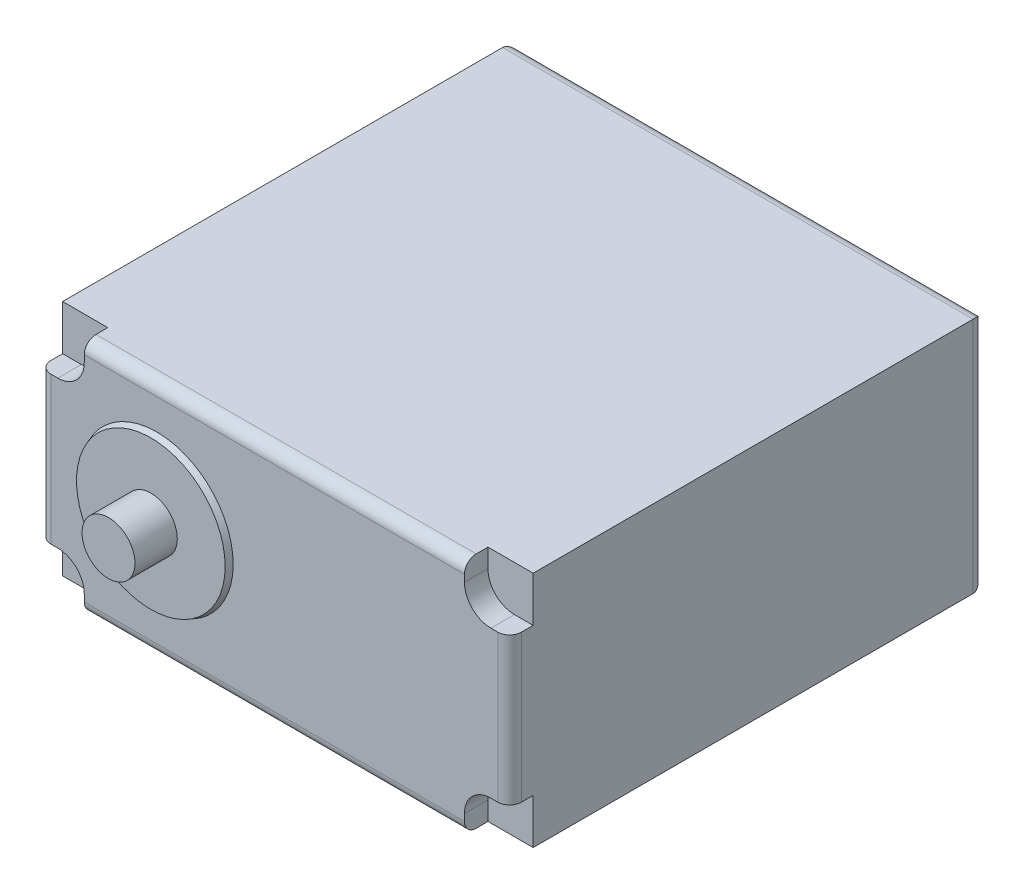
ISO-10303-21;
HEADER;
FILE_DESCRIPTION(('STEP AP214'),'2;1');
FILE_NAME('part.step','',(''),(''),'','','');
FILE_SCHEMA(('AUTOMOTIVE_DESIGN { 1 0 10303 214 1 1 1 1 }'));
ENDSEC;
DATA;
#1=APPLICATION_CONTEXT('core data for automotive mechanical design processes');
#2=APPLICATION_PROTOCOL_DEFINITION('international standard','automotive_design',2000,#1);
#3=PRODUCT_CONTEXT('',#1,'mechanical');
#4=PRODUCT('Part','Part','',(#3));
#5=PRODUCT_RELATED_PRODUCT_CATEGORY('part','',(#4));
#6=PRODUCT_DEFINITION_FORMATION('','',#4);
#7=PRODUCT_DEFINITION_CONTEXT('part definition',#1,'design');
#8=PRODUCT_DEFINITION('design','',#6,#7);
#9=PRODUCT_DEFINITION_SHAPE('','',#8);
#10=(LENGTH_UNIT() NAMED_UNIT(*) SI_UNIT(.MILLI.,.METRE.));
#11=(NAMED_UNIT(*) PLANE_ANGLE_UNIT() SI_UNIT($,.RADIAN.));
#12=(NAMED_UNIT(*) SI_UNIT($,.STERADIAN.) SOLID_ANGLE_UNIT());
#13=UNCERTAINTY_MEASURE_WITH_UNIT(LENGTH_MEASURE(1.E-05),#10,'distance_accuracy_value','');
#14=(GEOMETRIC_REPRESENTATION_CONTEXT(3) GLOBAL_UNCERTAINTY_ASSIGNED_CONTEXT((#13)) GLOBAL_UNIT_ASSIGNED_CONTEXT((#10,
#11,#12)) REPRESENTATION_CONTEXT('',''));
#15=CARTESIAN_POINT('',(0.,0.,0.));
#16=DIRECTION('',(0.,0.,1.));
#17=DIRECTION('',(1.,0.,0.));
#18=AXIS2_PLACEMENT_3D('',#15,#16,#17);
#19=CARTESIAN_POINT('',(0.,20.2,-40.4));
#20=DIRECTION('',(1.,0.,0.));
#21=DIRECTION('',(0.,0.,-1.));
#22=AXIS2_PLACEMENT_3D('',#19,#20,#21);
#23=PLANE('',#22);
#24=DIRECTION('',(0.,-1.,0.));
#25=VECTOR('',#24,1.);
#26=CARTESIAN_POINT('',(0.,20.2,-1.));
#27=LINE('',#26,#25);
#28=CARTESIAN_POINT('',(0.,3.84099025766973,-1.));
#29=VERTEX_POINT('',#28);
#30=CARTESIAN_POINT('',(0.,16.3590097423303,-1.));
#31=VERTEX_POINT('',#30);
#32=EDGE_CURVE('E426',#29,#31,#27,.F.);
#33=ORIENTED_EDGE('',*,*,#32,.T.);
#34=DIRECTION('',(0.,0.,-1.));
#35=VECTOR('',#34,1.);
#36=CARTESIAN_POINT('',(0.,16.3590097423303,-40.4));
#37=LINE('',#36,#35);
#38=CARTESIAN_POINT('',(0.,16.3590097423303,-2.));
#39=VERTEX_POINT('',#38);
#40=EDGE_CURVE('E374',#31,#39,#37,.T.);
#41=ORIENTED_EDGE('',*,*,#40,.T.);
#42=DIRECTION('',(0.,-1.,0.));
#43=VECTOR('',#42,1.);
#44=CARTESIAN_POINT('',(0.,20.2,-2.));
#45=LINE('',#44,#43);
#46=CARTESIAN_POINT('',(0.,20.2,-2.));
#47=VERTEX_POINT('',#46);
#48=EDGE_CURVE('E385',#47,#39,#45,.T.);
#49=ORIENTED_EDGE('',*,*,#48,.F.);
#50=DIRECTION('',(0.,0.,1.));
#51=VECTOR('',#50,1.);
#52=CARTESIAN_POINT('',(0.,20.2,-40.4));
#53=LINE('',#52,#51);
#54=CARTESIAN_POINT('',(0.,20.2,-39.4));
#55=VERTEX_POINT('',#54);
#56=EDGE_CURVE('E393',#55,#47,#53,.T.);
#57=ORIENTED_EDGE('',*,*,#56,.F.);
#58=DIRECTION('',(0.,-1.,0.));
#59=VECTOR('',#58,1.);
#60=CARTESIAN_POINT('',(0.,20.2,-39.4));
#61=LINE('',#60,#59);
#62=CARTESIAN_POINT('',(0.,0.,-39.4));
#63=VERTEX_POINT('',#62);
#64=EDGE_CURVE('E438',#55,#63,#61,.T.);
#65=ORIENTED_EDGE('',*,*,#64,.T.);
#66=DIRECTION('',(0.,0.,1.));
#67=VECTOR('',#66,1.);
#68=CARTESIAN_POINT('',(0.,0.,-40.4));
#69=LINE('',#68,#67);
#70=CARTESIAN_POINT('',(0.,0.,-2.));
#71=VERTEX_POINT('',#70);
#72=EDGE_CURVE('E402',#63,#71,#69,.T.);
#73=ORIENTED_EDGE('',*,*,#72,.T.);
#74=DIRECTION('',(0.,1.,0.));
#75=VECTOR('',#74,1.);
#76=CARTESIAN_POINT('',(0.,20.2,-2.));
#77=LINE('',#76,#75);
#78=CARTESIAN_POINT('',(0.,3.84099025766973,-2.));
#79=VERTEX_POINT('',#78);
#80=EDGE_CURVE('E381',#71,#79,#77,.T.);
#81=ORIENTED_EDGE('',*,*,#80,.T.);
#82=DIRECTION('',(0.,0.,1.));
#83=VECTOR('',#82,1.);
#84=CARTESIAN_POINT('',(0.,3.84099025766973,-40.4));
#85=LINE('',#84,#83);
#86=EDGE_CURVE('E370',#79,#29,#85,.T.);
#87=ORIENTED_EDGE('',*,*,#86,.T.);
#88=EDGE_LOOP('',(#33,#41,#49,#57,#65,#73,#81,#87));
#89=FACE_BOUND('',#88,.T.);
#90=ADVANCED_FACE('F51',(#89),#23,.F.);
#91=CARTESIAN_POINT('',(0.,20.2,0.));
#92=DIRECTION('',(0.,0.,-1.));
#93=DIRECTION('',(-1.,0.,0.));
#94=AXIS2_PLACEMENT_3D('',#91,#92,#93);
#95=PLANE('',#94);
#96=CARTESIAN_POINT('',(10.,10.1,0.));
#97=DIRECTION('',(0.,0.,-1.));
#98=DIRECTION('',(-1.,0.,0.));
#99=AXIS2_PLACEMENT_3D('',#96,#97,#98);
#100=CIRCLE('',#99,6.5);
#101=CARTESIAN_POINT('',(3.5,10.1,0.));
#102=VERTEX_POINT('',#101);
#103=EDGE_CURVE('E55',#102,#102,#100,.F.);
#104=ORIENTED_EDGE('',*,*,#103,.F.);
#105=EDGE_LOOP('',(#104));
#106=FACE_BOUND('',#105,.T.);
#107=CARTESIAN_POINT('',(38.4090097423303,18.6090097423303,0.));
#108=DIRECTION('',(0.,0.,1.));
#109=DIRECTION('',(-1.,0.,0.));
#110=AXIS2_PLACEMENT_3D('',#107,#108,#109);
#111=CIRCLE('',#110,2.25);
#112=CARTESIAN_POINT('',(36.1590097423303,18.6090097423303,0.));
#113=VERTEX_POINT('',#112);
#114=CARTESIAN_POINT('',(38.4090097423303,16.3590097423303,0.));
#115=VERTEX_POINT('',#114);
#116=EDGE_CURVE('E279',#113,#115,#111,.T.);
#117=ORIENTED_EDGE('',*,*,#116,.F.);
#118=DIRECTION('',(0.,-1.,0.));
#119=VECTOR('',#118,1.);
#120=CARTESIAN_POINT('',(36.1590097423303,18.6090097423303,0.));
#121=LINE('',#120,#119);
#122=CARTESIAN_POINT('',(36.1590097423303,19.2,0.));
#123=VERTEX_POINT('',#122);
#124=EDGE_CURVE('E307',#123,#113,#121,.T.);
#125=ORIENTED_EDGE('',*,*,#124,.F.);
#126=DIRECTION('',(1.,0.,0.));
#127=VECTOR('',#126,1.);
#128=CARTESIAN_POINT('',(0.,19.2,0.));
#129=LINE('',#128,#127);
#130=CARTESIAN_POINT('',(3.84099025766973,19.2,0.));
#131=VERTEX_POINT('',#130);
#132=EDGE_CURVE('E412',#123,#131,#129,.F.);
#133=ORIENTED_EDGE('',*,*,#132,.T.);
#134=DIRECTION('',(0.,1.,0.));
#135=VECTOR('',#134,1.);
#136=CARTESIAN_POINT('',(3.84099025766973,18.6090097423303,0.));
#137=LINE('',#136,#135);
#138=CARTESIAN_POINT('',(3.84099025766973,18.6090097423303,0.));
#139=VERTEX_POINT('',#138);
#140=EDGE_CURVE('E68',#139,#131,#137,.T.);
#141=ORIENTED_EDGE('',*,*,#140,.F.);
#142=CARTESIAN_POINT('',(1.59099025766973,18.6090097423303,0.));
#143=DIRECTION('',(0.,0.,1.));
#144=DIRECTION('',(1.,0.,0.));
#145=AXIS2_PLACEMENT_3D('',#142,#143,#144);
#146=CIRCLE('',#145,2.25);
#147=CARTESIAN_POINT('',(1.59099025766973,16.3590097423303,0.));
#148=VERTEX_POINT('',#147);
#149=EDGE_CURVE('E248',#148,#139,#146,.T.);
#150=ORIENTED_EDGE('',*,*,#149,.F.);
#151=DIRECTION('',(1.,0.,0.));
#152=VECTOR('',#151,1.);
#153=CARTESIAN_POINT('',(1.59099025766973,16.3590097423303,0.));
#154=LINE('',#153,#152);
#155=CARTESIAN_POINT('',(1.,16.3590097423303,0.));
#156=VERTEX_POINT('',#155);
#157=EDGE_CURVE('E280',#156,#148,#154,.T.);
#158=ORIENTED_EDGE('',*,*,#157,.F.);
#159=DIRECTION('',(0.,-1.,0.));
#160=VECTOR('',#159,1.);
#161=CARTESIAN_POINT('',(1.,20.2,0.));
#162=LINE('',#161,#160);
#163=CARTESIAN_POINT('',(1.,3.84099025766973,0.));
#164=VERTEX_POINT('',#163);
#165=EDGE_CURVE('E416',#156,#164,#162,.T.);
#166=ORIENTED_EDGE('',*,*,#165,.T.);
#167=DIRECTION('',(-1.,0.,0.));
#168=VECTOR('',#167,1.);
#169=CARTESIAN_POINT('',(1.59099025766973,3.84099025766973,0.));
#170=LINE('',#169,#168);
#171=CARTESIAN_POINT('',(1.59099025766973,3.84099025766973,0.));
#172=VERTEX_POINT('',#171);
#173=EDGE_CURVE('E237',#172,#164,#170,.T.);
#174=ORIENTED_EDGE('',*,*,#173,.F.);
#175=CARTESIAN_POINT('',(1.59099025766973,1.59099025766973,0.));
#176=DIRECTION('',(0.,0.,1.));
#177=DIRECTION('',(-1.,0.,0.));
#178=AXIS2_PLACEMENT_3D('',#175,#176,#177);
#179=CIRCLE('',#178,2.25);
#180=CARTESIAN_POINT('',(3.84099025766973,1.59099025766973,0.));
#181=VERTEX_POINT('',#180);
#182=EDGE_CURVE('E243',#181,#172,#179,.T.);
#183=ORIENTED_EDGE('',*,*,#182,.F.);
#184=DIRECTION('',(0.,1.,0.));
#185=VECTOR('',#184,1.);
#186=CARTESIAN_POINT('',(3.84099025766973,1.59099025766973,0.));
#187=LINE('',#186,#185);
#188=CARTESIAN_POINT('',(3.84099025766973,1.,0.));
#189=VERTEX_POINT('',#188);
#190=EDGE_CURVE('E226',#189,#181,#187,.T.);
#191=ORIENTED_EDGE('',*,*,#190,.F.);
#192=DIRECTION('',(1.,0.,0.));
#193=VECTOR('',#192,1.);
#194=CARTESIAN_POINT('',(0.,1.,0.));
#195=LINE('',#194,#193);
#196=CARTESIAN_POINT('',(36.1590097423303,1.,0.));
#197=VERTEX_POINT('',#196);
#198=EDGE_CURVE('E423',#189,#197,#195,.T.);
#199=ORIENTED_EDGE('',*,*,#198,.T.);
#200=DIRECTION('',(0.,-1.,0.));
#201=VECTOR('',#200,1.);
#202=CARTESIAN_POINT('',(36.1590097423303,1.59099025766973,0.));
#203=LINE('',#202,#201);
#204=CARTESIAN_POINT('',(36.1590097423303,1.59099025766973,0.));
#205=VERTEX_POINT('',#204);
#206=EDGE_CURVE('E254',#205,#197,#203,.T.);
#207=ORIENTED_EDGE('',*,*,#206,.F.);
#208=CARTESIAN_POINT('',(38.4090097423303,1.59099025766973,0.));
#209=DIRECTION('',(0.,0.,1.));
#210=DIRECTION('',(1.,0.,0.));
#211=AXIS2_PLACEMENT_3D('',#208,#209,#210);
#212=CIRCLE('',#211,2.25);
#213=CARTESIAN_POINT('',(38.4090097423303,3.84099025766973,0.));
#214=VERTEX_POINT('',#213);
#215=EDGE_CURVE('E331',#214,#205,#212,.T.);
#216=ORIENTED_EDGE('',*,*,#215,.F.);
#217=DIRECTION('',(-1.,0.,0.));
#218=VECTOR('',#217,1.);
#219=CARTESIAN_POINT('',(38.4090097423303,3.84099025766973,0.));
#220=LINE('',#219,#218);
#221=CARTESIAN_POINT('',(39.,3.84099025766973,0.));
#222=VERTEX_POINT('',#221);
#223=EDGE_CURVE('E258',#222,#214,#220,.T.);
#224=ORIENTED_EDGE('',*,*,#223,.F.);
#225=DIRECTION('',(0.,-1.,0.));
#226=VECTOR('',#225,1.);
#227=CARTESIAN_POINT('',(39.,20.2,0.));
#228=LINE('',#227,#226);
#229=CARTESIAN_POINT('',(39.,16.3590097423303,0.));
#230=VERTEX_POINT('',#229);
#231=EDGE_CURVE('E419',#222,#230,#228,.F.);
#232=ORIENTED_EDGE('',*,*,#231,.T.);
#233=DIRECTION('',(1.,0.,0.));
#234=VECTOR('',#233,1.);
#235=CARTESIAN_POINT('',(38.4090097423303,16.3590097423303,0.));
#236=LINE('',#235,#234);
#237=EDGE_CURVE('E310',#115,#230,#236,.T.);
#238=ORIENTED_EDGE('',*,*,#237,.F.);
#239=EDGE_LOOP('',(#117,#125,#133,#141,#150,#158,#166,#174,#183,#191,#199,#207,#216,#224,#232,#238));
#240=FACE_BOUND('',#239,.T.);
#241=ADVANCED_FACE('F251',(#106,#240),#95,.F.);
#242=CARTESIAN_POINT('',(40.,20.2,0.));
#243=DIRECTION('',(-1.,0.,0.));
#244=DIRECTION('',(0.,0.,1.));
#245=AXIS2_PLACEMENT_3D('',#242,#243,#244);
#246=PLANE('',#245);
#247=DIRECTION('',(0.,-1.,0.));
#248=VECTOR('',#247,1.);
#249=CARTESIAN_POINT('',(40.,20.2,-2.));
#250=LINE('',#249,#248);
#251=CARTESIAN_POINT('',(40.,20.2,-2.));
#252=VERTEX_POINT('',#251);
#253=CARTESIAN_POINT('',(40.,16.3590097423303,-2.));
#254=VERTEX_POINT('',#253);
#255=EDGE_CURVE('E388',#252,#254,#250,.T.);
#256=ORIENTED_EDGE('',*,*,#255,.T.);
#257=DIRECTION('',(0.,0.,1.));
#258=VECTOR('',#257,1.);
#259=CARTESIAN_POINT('',(40.,16.3590097423303,0.));
#260=LINE('',#259,#258);
#261=CARTESIAN_POINT('',(40.,16.3590097423303,-1.));
#262=VERTEX_POINT('',#261);
#263=EDGE_CURVE('E354',#254,#262,#260,.T.);
#264=ORIENTED_EDGE('',*,*,#263,.T.);
#265=DIRECTION('',(0.,-1.,0.));
#266=VECTOR('',#265,1.);
#267=CARTESIAN_POINT('',(40.,20.2,-1.));
#268=LINE('',#267,#266);
#269=CARTESIAN_POINT('',(40.,3.84099025766973,-1.));
#270=VERTEX_POINT('',#269);
#271=EDGE_CURVE('E401',#262,#270,#268,.T.);
#272=ORIENTED_EDGE('',*,*,#271,.T.);
#273=DIRECTION('',(0.,0.,-1.));
#274=VECTOR('',#273,1.);
#275=CARTESIAN_POINT('',(40.,3.84099025766973,0.));
#276=LINE('',#275,#274);
#277=CARTESIAN_POINT('',(40.,3.84099025766973,-2.));
#278=VERTEX_POINT('',#277);
#279=EDGE_CURVE('E347',#270,#278,#276,.T.);
#280=ORIENTED_EDGE('',*,*,#279,.T.);
#281=DIRECTION('',(0.,1.,0.));
#282=VECTOR('',#281,1.);
#283=CARTESIAN_POINT('',(40.,20.2,-2.));
#284=LINE('',#283,#282);
#285=CARTESIAN_POINT('',(40.,0.,-2.));
#286=VERTEX_POINT('',#285);
#287=EDGE_CURVE('E378',#286,#278,#284,.T.);
#288=ORIENTED_EDGE('',*,*,#287,.F.);
#289=DIRECTION('',(0.,0.,-1.));
#290=VECTOR('',#289,1.);
#291=CARTESIAN_POINT('',(40.,0.,0.));
#292=LINE('',#291,#290);
#293=CARTESIAN_POINT('',(40.,0.,-39.4));
#294=VERTEX_POINT('',#293);
#295=EDGE_CURVE('E398',#286,#294,#292,.T.);
#296=ORIENTED_EDGE('',*,*,#295,.T.);
#297=DIRECTION('',(0.,-1.,0.));
#298=VECTOR('',#297,1.);
#299=CARTESIAN_POINT('',(40.,20.2,-39.4));
#300=LINE('',#299,#298);
#301=CARTESIAN_POINT('',(40.,20.2,-39.4));
#302=VERTEX_POINT('',#301);
#303=EDGE_CURVE('E455',#294,#302,#300,.F.);
#304=ORIENTED_EDGE('',*,*,#303,.T.);
#305=DIRECTION('',(0.,0.,-1.));
#306=VECTOR('',#305,1.);
#307=CARTESIAN_POINT('',(40.,20.2,0.));
#308=LINE('',#307,#306);
#309=EDGE_CURVE('E397',#252,#302,#308,.T.);
#310=ORIENTED_EDGE('',*,*,#309,.F.);
#311=EDGE_LOOP('',(#256,#264,#272,#280,#288,#296,#304,#310));
#312=FACE_BOUND('',#311,.T.);
#313=ADVANCED_FACE('F523',(#312),#246,.F.);
#314=CARTESIAN_POINT('',(40.,20.2,-40.4));
#315=DIRECTION('',(0.,0.,1.));
#316=DIRECTION('',(1.,0.,0.));
#317=AXIS2_PLACEMENT_3D('',#314,#315,#316);
#318=PLANE('',#317);
#319=CARTESIAN_POINT('',(10.,10.1,-40.4));
#320=DIRECTION('',(0.,0.,1.));
#321=DIRECTION('',(1.,0.,0.));
#322=AXIS2_PLACEMENT_3D('',#319,#320,#321);
#323=CIRCLE('',#322,6.5);
#324=CARTESIAN_POINT('',(16.5,10.1,-40.4));
#325=VERTEX_POINT('',#324);
#326=EDGE_CURVE('E682',#325,#325,#323,.T.);
#327=ORIENTED_EDGE('',*,*,#326,.T.);
#328=EDGE_LOOP('',(#327));
#329=FACE_BOUND('',#328,.T.);
#330=DIRECTION('',(0.,-1.,0.));
#331=VECTOR('',#330,1.);
#332=CARTESIAN_POINT('',(39.,20.2,-40.4));
#333=LINE('',#332,#331);
#334=CARTESIAN_POINT('',(39.,19.2,-40.4));
#335=VERTEX_POINT('',#334);
#336=CARTESIAN_POINT('',(39.,1.,-40.4));
#337=VERTEX_POINT('',#336);
#338=EDGE_CURVE('E445',#335,#337,#333,.T.);
#339=ORIENTED_EDGE('',*,*,#338,.T.);
#340=DIRECTION('',(-1.,0.,0.));
#341=VECTOR('',#340,1.);
#342=CARTESIAN_POINT('',(40.,1.,-40.4));
#343=LINE('',#342,#341);
#344=CARTESIAN_POINT('',(1.,1.,-40.4));
#345=VERTEX_POINT('',#344);
#346=EDGE_CURVE('E452',#337,#345,#343,.T.);
#347=ORIENTED_EDGE('',*,*,#346,.T.);
#348=DIRECTION('',(0.,-1.,0.));
#349=VECTOR('',#348,1.);
#350=CARTESIAN_POINT('',(1.,20.2,-40.4));
#351=LINE('',#350,#349);
#352=CARTESIAN_POINT('',(1.,19.2,-40.4));
#353=VERTEX_POINT('',#352);
#354=EDGE_CURVE('E448',#345,#353,#351,.F.);
#355=ORIENTED_EDGE('',*,*,#354,.T.);
#356=DIRECTION('',(-1.,0.,0.));
#357=VECTOR('',#356,1.);
#358=CARTESIAN_POINT('',(40.,19.2,-40.4));
#359=LINE('',#358,#357);
#360=EDGE_CURVE('E442',#353,#335,#359,.F.);
#361=ORIENTED_EDGE('',*,*,#360,.T.);
#362=EDGE_LOOP('',(#339,#347,#355,#361));
#363=FACE_BOUND('',#362,.T.);
#364=ADVANCED_FACE('F530',(#329,#363),#318,.F.);
#365=CARTESIAN_POINT('',(0.,20.2,0.));
#366=DIRECTION('',(0.,1.,0.));
#367=DIRECTION('',(0.,0.,1.));
#368=AXIS2_PLACEMENT_3D('',#365,#366,#367);
#369=PLANE('',#368);
#370=DIRECTION('',(0.,0.,1.));
#371=VECTOR('',#370,1.);
#372=CARTESIAN_POINT('',(36.1590097423303,20.2,0.));
#373=LINE('',#372,#371);
#374=CARTESIAN_POINT('',(36.1590097423303,20.2,-2.));
#375=VERTEX_POINT('',#374);
#376=CARTESIAN_POINT('',(36.1590097423303,20.2,-1.));
#377=VERTEX_POINT('',#376);
#378=EDGE_CURVE('E367',#375,#377,#373,.T.);
#379=ORIENTED_EDGE('',*,*,#378,.F.);
#380=DIRECTION('',(-1.,0.,0.));
#381=VECTOR('',#380,1.);
#382=CARTESIAN_POINT('',(0.,20.2,-2.));
#383=LINE('',#382,#381);
#384=EDGE_CURVE('E511',#252,#375,#383,.T.);
#385=ORIENTED_EDGE('',*,*,#384,.F.);
#386=ORIENTED_EDGE('',*,*,#309,.T.);
#387=DIRECTION('',(-1.,0.,0.));
#388=VECTOR('',#387,1.);
#389=CARTESIAN_POINT('',(0.,20.2,-39.4));
#390=LINE('',#389,#388);
#391=EDGE_CURVE('E463',#302,#55,#390,.T.);
#392=ORIENTED_EDGE('',*,*,#391,.T.);
#393=ORIENTED_EDGE('',*,*,#56,.T.);
#394=DIRECTION('',(1.,0.,0.));
#395=VECTOR('',#394,1.);
#396=CARTESIAN_POINT('',(0.,20.2,-2.));
#397=LINE('',#396,#395);
#398=CARTESIAN_POINT('',(3.84099025766973,20.2,-2.));
#399=VERTEX_POINT('',#398);
#400=EDGE_CURVE('E508',#47,#399,#397,.T.);
#401=ORIENTED_EDGE('',*,*,#400,.T.);
#402=DIRECTION('',(0.,0.,-1.));
#403=VECTOR('',#402,1.);
#404=CARTESIAN_POINT('',(3.84099025766973,20.2,0.));
#405=LINE('',#404,#403);
#406=CARTESIAN_POINT('',(3.84099025766973,20.2,-1.));
#407=VERTEX_POINT('',#406);
#408=EDGE_CURVE('E364',#407,#399,#405,.T.);
#409=ORIENTED_EDGE('',*,*,#408,.F.);
#410=DIRECTION('',(1.,0.,0.));
#411=VECTOR('',#410,1.);
#412=CARTESIAN_POINT('',(40.,20.2,-1.));
#413=LINE('',#412,#411);
#414=EDGE_CURVE('E434',#407,#377,#413,.T.);
#415=ORIENTED_EDGE('',*,*,#414,.T.);
#416=EDGE_LOOP('',(#379,#385,#386,#392,#393,#401,#409,#415));
#417=FACE_BOUND('',#416,.T.);
#418=ADVANCED_FACE('F609',(#417),#369,.T.);
#419=CARTESIAN_POINT('',(0.,0.,0.));
#420=DIRECTION('',(0.,1.,0.));
#421=DIRECTION('',(0.,0.,1.));
#422=AXIS2_PLACEMENT_3D('',#419,#420,#421);
#423=PLANE('',#422);
#424=DIRECTION('',(1.,0.,0.));
#425=VECTOR('',#424,1.);
#426=CARTESIAN_POINT('',(0.,0.,-1.));
#427=LINE('',#426,#425);
#428=CARTESIAN_POINT('',(36.1590097423303,0.,-1.));
#429=VERTEX_POINT('',#428);
#430=CARTESIAN_POINT('',(3.84099025766973,0.,-1.));
#431=VERTEX_POINT('',#430);
#432=EDGE_CURVE('E430',#429,#431,#427,.F.);
#433=ORIENTED_EDGE('',*,*,#432,.T.);
#434=DIRECTION('',(0.,0.,-1.));
#435=VECTOR('',#434,1.);
#436=CARTESIAN_POINT('',(3.84099025766973,0.,0.));
#437=LINE('',#436,#435);
#438=CARTESIAN_POINT('',(3.84099025766973,0.,-2.));
#439=VERTEX_POINT('',#438);
#440=EDGE_CURVE('E76',#431,#439,#437,.T.);
#441=ORIENTED_EDGE('',*,*,#440,.T.);
#442=DIRECTION('',(-1.,0.,0.));
#443=VECTOR('',#442,1.);
#444=CARTESIAN_POINT('',(0.,0.,-2.));
#445=LINE('',#444,#443);
#446=EDGE_CURVE('E504',#439,#71,#445,.T.);
#447=ORIENTED_EDGE('',*,*,#446,.T.);
#448=ORIENTED_EDGE('',*,*,#72,.F.);
#449=DIRECTION('',(-1.,0.,0.));
#450=VECTOR('',#449,1.);
#451=CARTESIAN_POINT('',(0.,0.,-39.4));
#452=LINE('',#451,#450);
#453=EDGE_CURVE('E459',#63,#294,#452,.F.);
#454=ORIENTED_EDGE('',*,*,#453,.T.);
#455=ORIENTED_EDGE('',*,*,#295,.F.);
#456=DIRECTION('',(1.,0.,0.));
#457=VECTOR('',#456,1.);
#458=CARTESIAN_POINT('',(0.,0.,-2.));
#459=LINE('',#458,#457);
#460=CARTESIAN_POINT('',(36.1590097423303,0.,-2.));
#461=VERTEX_POINT('',#460);
#462=EDGE_CURVE('E501',#461,#286,#459,.T.);
#463=ORIENTED_EDGE('',*,*,#462,.F.);
#464=DIRECTION('',(0.,0.,1.));
#465=VECTOR('',#464,1.);
#466=CARTESIAN_POINT('',(36.1590097423303,0.,0.));
#467=LINE('',#466,#465);
#468=EDGE_CURVE('E358',#461,#429,#467,.T.);
#469=ORIENTED_EDGE('',*,*,#468,.T.);
#470=EDGE_LOOP('',(#433,#441,#447,#448,#454,#455,#463,#469));
#471=FACE_BOUND('',#470,.T.);
#472=ADVANCED_FACE('F553',(#471),#423,.F.);
#473=CARTESIAN_POINT('',(1.,20.2,-1.));
#474=DIRECTION('',(0.,-1.,0.));
#475=DIRECTION('',(0.,0.,-1.));
#476=AXIS2_PLACEMENT_3D('',#473,#474,#475);
#477=CYLINDRICAL_SURFACE('',#476,1.);
#478=CARTESIAN_POINT('',(1.,16.3590097423303,-1.));
#479=DIRECTION('',(0.,-1.,0.));
#480=DIRECTION('',(0.,0.,-1.));
#481=AXIS2_PLACEMENT_3D('',#478,#479,#480);
#482=CIRCLE('',#481,1.);
#483=EDGE_CURVE('E498',#31,#156,#482,.F.);
#484=ORIENTED_EDGE('',*,*,#483,.F.);
#485=ORIENTED_EDGE('',*,*,#32,.F.);
#486=CARTESIAN_POINT('',(1.,3.84099025766973,-1.));
#487=DIRECTION('',(0.,1.,0.));
#488=DIRECTION('',(0.,0.,1.));
#489=AXIS2_PLACEMENT_3D('',#486,#487,#488);
#490=CIRCLE('',#489,1.);
#491=EDGE_CURVE('E495',#164,#29,#490,.F.);
#492=ORIENTED_EDGE('',*,*,#491,.F.);
#493=ORIENTED_EDGE('',*,*,#165,.F.);
#494=EDGE_LOOP('',(#484,#485,#492,#493));
#495=FACE_BOUND('',#494,.T.);
#496=ADVANCED_FACE('F549',(#495),#477,.T.);
#497=CARTESIAN_POINT('',(0.,19.2,-1.));
#498=DIRECTION('',(-1.,0.,0.));
#499=DIRECTION('',(0.,0.,1.));
#500=AXIS2_PLACEMENT_3D('',#497,#498,#499);
#501=CYLINDRICAL_SURFACE('',#500,1.);
#502=CARTESIAN_POINT('',(36.1590097423303,19.2,-1.));
#503=DIRECTION('',(-1.,0.,0.));
#504=DIRECTION('',(0.,0.,1.));
#505=AXIS2_PLACEMENT_3D('',#502,#503,#504);
#506=CIRCLE('',#505,1.);
#507=EDGE_CURVE('E492',#377,#123,#506,.F.);
#508=ORIENTED_EDGE('',*,*,#507,.F.);
#509=ORIENTED_EDGE('',*,*,#414,.F.);
#510=CARTESIAN_POINT('',(3.84099025766973,19.2,-1.));
#511=DIRECTION('',(1.,0.,0.));
#512=DIRECTION('',(0.,0.,-1.));
#513=AXIS2_PLACEMENT_3D('',#510,#511,#512);
#514=CIRCLE('',#513,1.);
#515=EDGE_CURVE('E489',#131,#407,#514,.F.);
#516=ORIENTED_EDGE('',*,*,#515,.F.);
#517=ORIENTED_EDGE('',*,*,#132,.F.);
#518=EDGE_LOOP('',(#508,#509,#516,#517));
#519=FACE_BOUND('',#518,.T.);
#520=ADVANCED_FACE('F545',(#519),#501,.T.);
#521=CARTESIAN_POINT('',(0.,1.,-1.));
#522=DIRECTION('',(1.,0.,0.));
#523=DIRECTION('',(0.,0.,-1.));
#524=AXIS2_PLACEMENT_3D('',#521,#522,#523);
#525=CYLINDRICAL_SURFACE('',#524,1.);
#526=CARTESIAN_POINT('',(3.84099025766973,1.,-1.));
#527=DIRECTION('',(1.,0.,0.));
#528=DIRECTION('',(0.,0.,-1.));
#529=AXIS2_PLACEMENT_3D('',#526,#527,#528);
#530=CIRCLE('',#529,1.);
#531=EDGE_CURVE('E231',#431,#189,#530,.F.);
#532=ORIENTED_EDGE('',*,*,#531,.F.);
#533=ORIENTED_EDGE('',*,*,#432,.F.);
#534=CARTESIAN_POINT('',(36.1590097423303,1.,-1.));
#535=DIRECTION('',(-1.,0.,0.));
#536=DIRECTION('',(0.,0.,1.));
#537=AXIS2_PLACEMENT_3D('',#534,#535,#536);
#538=CIRCLE('',#537,1.);
#539=EDGE_CURVE('E484',#197,#429,#538,.F.);
#540=ORIENTED_EDGE('',*,*,#539,.F.);
#541=ORIENTED_EDGE('',*,*,#198,.F.);
#542=EDGE_LOOP('',(#532,#533,#540,#541));
#543=FACE_BOUND('',#542,.T.);
#544=ADVANCED_FACE('F541',(#543),#525,.T.);
#545=CARTESIAN_POINT('',(39.,20.2,-1.));
#546=DIRECTION('',(0.,-1.,0.));
#547=DIRECTION('',(0.,0.,-1.));
#548=AXIS2_PLACEMENT_3D('',#545,#546,#547);
#549=CYLINDRICAL_SURFACE('',#548,1.);
#550=CARTESIAN_POINT('',(39.,16.3590097423303,-1.));
#551=DIRECTION('',(0.,-1.,0.));
#552=DIRECTION('',(0.,0.,-1.));
#553=AXIS2_PLACEMENT_3D('',#550,#551,#552);
#554=CIRCLE('',#553,1.);
#555=EDGE_CURVE('E481',#230,#262,#554,.F.);
#556=ORIENTED_EDGE('',*,*,#555,.F.);
#557=ORIENTED_EDGE('',*,*,#231,.F.);
#558=CARTESIAN_POINT('',(39.,3.84099025766973,-1.));
#559=DIRECTION('',(0.,1.,0.));
#560=DIRECTION('',(0.,0.,1.));
#561=AXIS2_PLACEMENT_3D('',#558,#559,#560);
#562=CIRCLE('',#561,1.);
#563=EDGE_CURVE('E466',#270,#222,#562,.F.);
#564=ORIENTED_EDGE('',*,*,#563,.F.);
#565=ORIENTED_EDGE('',*,*,#271,.F.);
#566=EDGE_LOOP('',(#556,#557,#564,#565));
#567=FACE_BOUND('',#566,.T.);
#568=ADVANCED_FACE('F538',(#567),#549,.T.);
#569=CARTESIAN_POINT('',(39.,20.2,-39.4));
#570=DIRECTION('',(0.,-1.,0.));
#571=DIRECTION('',(0.,0.,-1.));
#572=AXIS2_PLACEMENT_3D('',#569,#570,#571);
#573=CYLINDRICAL_SURFACE('',#572,1.);
#574=CARTESIAN_POINT('',(39.,1.,-39.4));
#575=DIRECTION('',(-0.707106781186547,-0.707106781186547,0.));
#576=DIRECTION('',(-0.707106781186547,0.707106781186547,0.));
#577=AXIS2_PLACEMENT_3D('',#574,#575,#576);
#578=ELLIPSE('',#577,1.41421356237309,1.);
#579=EDGE_CURVE('E472',#337,#294,#578,.T.);
#580=ORIENTED_EDGE('',*,*,#579,.F.);
#581=ORIENTED_EDGE('',*,*,#338,.F.);
#582=CARTESIAN_POINT('',(39.,19.2,-39.4));
#583=DIRECTION('',(0.707106781186547,-0.707106781186547,0.));
#584=DIRECTION('',(0.707106781186547,0.707106781186547,0.));
#585=AXIS2_PLACEMENT_3D('',#582,#583,#584);
#586=ELLIPSE('',#585,1.41421356237309,1.);
#587=EDGE_CURVE('E406',#302,#335,#586,.F.);
#588=ORIENTED_EDGE('',*,*,#587,.F.);
#589=ORIENTED_EDGE('',*,*,#303,.F.);
#590=EDGE_LOOP('',(#580,#581,#588,#589));
#591=FACE_BOUND('',#590,.T.);
#592=ADVANCED_FACE('F53',(#591),#573,.T.);
#593=CARTESIAN_POINT('',(0.,19.2,-39.4));
#594=DIRECTION('',(1.,0.,0.));
#595=DIRECTION('',(0.,0.,-1.));
#596=AXIS2_PLACEMENT_3D('',#593,#594,#595);
#597=CYLINDRICAL_SURFACE('',#596,1.);
#598=ORIENTED_EDGE('',*,*,#587,.T.);
#599=ORIENTED_EDGE('',*,*,#360,.F.);
#600=CARTESIAN_POINT('',(1.,19.2,-39.4));
#601=DIRECTION('',(0.707106781186547,0.707106781186547,0.));
#602=DIRECTION('',(0.707106781186547,-0.707106781186547,0.));
#603=AXIS2_PLACEMENT_3D('',#600,#601,#602);
#604=ELLIPSE('',#603,1.41421356237309,1.);
#605=EDGE_CURVE('E469',#55,#353,#604,.F.);
#606=ORIENTED_EDGE('',*,*,#605,.F.);
#607=ORIENTED_EDGE('',*,*,#391,.F.);
#608=EDGE_LOOP('',(#598,#599,#606,#607));
#609=FACE_BOUND('',#608,.T.);
#610=ADVANCED_FACE('F562',(#609),#597,.T.);
#611=CARTESIAN_POINT('',(40.,1.,-39.4));
#612=DIRECTION('',(-1.,0.,0.));
#613=DIRECTION('',(0.,0.,1.));
#614=AXIS2_PLACEMENT_3D('',#611,#612,#613);
#615=CYLINDRICAL_SURFACE('',#614,1.);
#616=ORIENTED_EDGE('',*,*,#579,.T.);
#617=ORIENTED_EDGE('',*,*,#453,.F.);
#618=CARTESIAN_POINT('',(1.,1.,-39.4));
#619=DIRECTION('',(-0.707106781186547,0.707106781186547,0.));
#620=DIRECTION('',(-0.707106781186547,-0.707106781186547,0.));
#621=AXIS2_PLACEMENT_3D('',#618,#619,#620);
#622=ELLIPSE('',#621,1.41421356237309,1.);
#623=EDGE_CURVE('E392',#345,#63,#622,.T.);
#624=ORIENTED_EDGE('',*,*,#623,.F.);
#625=ORIENTED_EDGE('',*,*,#346,.F.);
#626=EDGE_LOOP('',(#616,#617,#624,#625));
#627=FACE_BOUND('',#626,.T.);
#628=ADVANCED_FACE('F559',(#627),#615,.T.);
#629=CARTESIAN_POINT('',(1.,20.2,-39.4));
#630=DIRECTION('',(0.,-1.,0.));
#631=DIRECTION('',(0.,0.,-1.));
#632=AXIS2_PLACEMENT_3D('',#629,#630,#631);
#633=CYLINDRICAL_SURFACE('',#632,1.);
#634=ORIENTED_EDGE('',*,*,#605,.T.);
#635=ORIENTED_EDGE('',*,*,#354,.F.);
#636=ORIENTED_EDGE('',*,*,#623,.T.);
#637=ORIENTED_EDGE('',*,*,#64,.F.);
#638=EDGE_LOOP('',(#634,#635,#636,#637));
#639=FACE_BOUND('',#638,.T.);
#640=ADVANCED_FACE('F555',(#639),#633,.T.);
#641=CARTESIAN_POINT('',(38.4090097423303,1.59099025766973,-2.));
#642=DIRECTION('',(0.,0.,1.));
#643=DIRECTION('',(1.,0.,0.));
#644=AXIS2_PLACEMENT_3D('',#641,#642,#643);
#645=PLANE('',#644);
#646=ORIENTED_EDGE('',*,*,#287,.T.);
#647=DIRECTION('',(-1.,0.,0.));
#648=VECTOR('',#647,1.);
#649=CARTESIAN_POINT('',(38.4090097423303,3.84099025766973,-2.));
#650=LINE('',#649,#648);
#651=CARTESIAN_POINT('',(38.4090097423303,3.84099025766973,-2.));
#652=VERTEX_POINT('',#651);
#653=EDGE_CURVE('E330',#278,#652,#650,.T.);
#654=ORIENTED_EDGE('',*,*,#653,.T.);
#655=CARTESIAN_POINT('',(38.4090097423303,1.59099025766973,-2.));
#656=DIRECTION('',(0.,0.,1.));
#657=DIRECTION('',(1.,0.,0.));
#658=AXIS2_PLACEMENT_3D('',#655,#656,#657);
#659=CIRCLE('',#658,2.25);
#660=CARTESIAN_POINT('',(36.1590097423303,1.59099025766973,-2.));
#661=VERTEX_POINT('',#660);
#662=EDGE_CURVE('E334',#652,#661,#659,.T.);
#663=ORIENTED_EDGE('',*,*,#662,.T.);
#664=DIRECTION('',(0.,-1.,0.));
#665=VECTOR('',#664,1.);
#666=CARTESIAN_POINT('',(36.1590097423303,1.59099025766973,-2.));
#667=LINE('',#666,#665);
#668=EDGE_CURVE('E326',#661,#461,#667,.T.);
#669=ORIENTED_EDGE('',*,*,#668,.T.);
#670=ORIENTED_EDGE('',*,*,#462,.T.);
#671=EDGE_LOOP('',(#646,#654,#663,#669,#670));
#672=FACE_BOUND('',#671,.T.);
#673=ADVANCED_FACE('F558',(#672),#645,.T.);
#674=CARTESIAN_POINT('',(36.1590097423303,1.59099025766973,-2.));
#675=DIRECTION('',(-1.,0.,0.));
#676=DIRECTION('',(0.,0.,1.));
#677=AXIS2_PLACEMENT_3D('',#674,#675,#676);
#678=PLANE('',#677);
#679=ORIENTED_EDGE('',*,*,#668,.F.);
#680=DIRECTION('',(0.,0.,1.));
#681=VECTOR('',#680,1.);
#682=CARTESIAN_POINT('',(36.1590097423303,1.59099025766973,-2.));
#683=LINE('',#682,#681);
#684=EDGE_CURVE('E344',#661,#205,#683,.T.);
#685=ORIENTED_EDGE('',*,*,#684,.T.);
#686=ORIENTED_EDGE('',*,*,#206,.T.);
#687=ORIENTED_EDGE('',*,*,#539,.T.);
#688=ORIENTED_EDGE('',*,*,#468,.F.);
#689=EDGE_LOOP('',(#679,#685,#686,#687,#688));
#690=FACE_BOUND('',#689,.T.);
#691=ADVANCED_FACE('F620',(#690),#678,.F.);
#692=CARTESIAN_POINT('',(38.4090097423303,3.84099025766973,-2.));
#693=DIRECTION('',(0.,1.,0.));
#694=DIRECTION('',(0.,0.,1.));
#695=AXIS2_PLACEMENT_3D('',#692,#693,#694);
#696=PLANE('',#695);
#697=ORIENTED_EDGE('',*,*,#563,.T.);
#698=ORIENTED_EDGE('',*,*,#223,.T.);
#699=DIRECTION('',(0.,0.,1.));
#700=VECTOR('',#699,1.);
#701=CARTESIAN_POINT('',(38.4090097423303,3.84099025766973,-2.));
#702=LINE('',#701,#700);
#703=EDGE_CURVE('E337',#652,#214,#702,.T.);
#704=ORIENTED_EDGE('',*,*,#703,.F.);
#705=ORIENTED_EDGE('',*,*,#653,.F.);
#706=ORIENTED_EDGE('',*,*,#279,.F.);
#707=EDGE_LOOP('',(#697,#698,#704,#705,#706));
#708=FACE_BOUND('',#707,.T.);
#709=ADVANCED_FACE('F630',(#708),#696,.F.);
#710=CARTESIAN_POINT('',(38.4090097423303,1.59099025766973,-2.));
#711=DIRECTION('',(0.,0.,1.));
#712=DIRECTION('',(1.,0.,0.));
#713=AXIS2_PLACEMENT_3D('',#710,#711,#712);
#714=CYLINDRICAL_SURFACE('',#713,2.25);
#715=ORIENTED_EDGE('',*,*,#215,.T.);
#716=ORIENTED_EDGE('',*,*,#684,.F.);
#717=ORIENTED_EDGE('',*,*,#662,.F.);
#718=ORIENTED_EDGE('',*,*,#703,.T.);
#719=EDGE_LOOP('',(#715,#716,#717,#718));
#720=FACE_BOUND('',#719,.T.);
#721=ADVANCED_FACE('F627',(#720),#714,.F.);
#722=CARTESIAN_POINT('',(38.4090097423303,18.6090097423303,-2.));
#723=DIRECTION('',(0.,0.,-1.));
#724=DIRECTION('',(-1.,0.,0.));
#725=AXIS2_PLACEMENT_3D('',#722,#723,#724);
#726=PLANE('',#725);
#727=ORIENTED_EDGE('',*,*,#384,.T.);
#728=DIRECTION('',(0.,-1.,0.));
#729=VECTOR('',#728,1.);
#730=CARTESIAN_POINT('',(36.1590097423303,18.6090097423303,-2.));
#731=LINE('',#730,#729);
#732=CARTESIAN_POINT('',(36.1590097423303,18.6090097423303,-2.));
#733=VERTEX_POINT('',#732);
#734=EDGE_CURVE('E301',#375,#733,#731,.T.);
#735=ORIENTED_EDGE('',*,*,#734,.T.);
#736=CARTESIAN_POINT('',(38.4090097423303,18.6090097423303,-2.));
#737=DIRECTION('',(0.,0.,1.));
#738=DIRECTION('',(-1.,0.,0.));
#739=AXIS2_PLACEMENT_3D('',#736,#737,#738);
#740=CIRCLE('',#739,2.25);
#741=CARTESIAN_POINT('',(38.4090097423303,16.3590097423303,-2.));
#742=VERTEX_POINT('',#741);
#743=EDGE_CURVE('E311',#733,#742,#740,.T.);
#744=ORIENTED_EDGE('',*,*,#743,.T.);
#745=DIRECTION('',(1.,0.,0.));
#746=VECTOR('',#745,1.);
#747=CARTESIAN_POINT('',(38.4090097423303,16.3590097423303,-2.));
#748=LINE('',#747,#746);
#749=EDGE_CURVE('E319',#742,#254,#748,.T.);
#750=ORIENTED_EDGE('',*,*,#749,.T.);
#751=ORIENTED_EDGE('',*,*,#255,.F.);
#752=EDGE_LOOP('',(#727,#735,#744,#750,#751));
#753=FACE_BOUND('',#752,.T.);
#754=ADVANCED_FACE('F637',(#753),#726,.F.);
#755=CARTESIAN_POINT('',(38.4090097423303,16.3590097423303,-2.));
#756=DIRECTION('',(0.,-1.,0.));
#757=DIRECTION('',(0.,0.,-1.));
#758=AXIS2_PLACEMENT_3D('',#755,#756,#757);
#759=PLANE('',#758);
#760=ORIENTED_EDGE('',*,*,#749,.F.);
#761=DIRECTION('',(0.,0.,1.));
#762=VECTOR('',#761,1.);
#763=CARTESIAN_POINT('',(38.4090097423303,16.3590097423303,-2.));
#764=LINE('',#763,#762);
#765=EDGE_CURVE('E298',#742,#115,#764,.T.);
#766=ORIENTED_EDGE('',*,*,#765,.T.);
#767=ORIENTED_EDGE('',*,*,#237,.T.);
#768=ORIENTED_EDGE('',*,*,#555,.T.);
#769=ORIENTED_EDGE('',*,*,#263,.F.);
#770=EDGE_LOOP('',(#760,#766,#767,#768,#769));
#771=FACE_BOUND('',#770,.T.);
#772=ADVANCED_FACE('F636',(#771),#759,.F.);
#773=CARTESIAN_POINT('',(38.4090097423303,18.6090097423303,-2.));
#774=DIRECTION('',(0.,0.,1.));
#775=DIRECTION('',(1.,0.,0.));
#776=AXIS2_PLACEMENT_3D('',#773,#774,#775);
#777=CYLINDRICAL_SURFACE('',#776,2.25);
#778=ORIENTED_EDGE('',*,*,#116,.T.);
#779=ORIENTED_EDGE('',*,*,#765,.F.);
#780=ORIENTED_EDGE('',*,*,#743,.F.);
#781=DIRECTION('',(0.,0.,1.));
#782=VECTOR('',#781,1.);
#783=CARTESIAN_POINT('',(36.1590097423303,18.6090097423303,-2.));
#784=LINE('',#783,#782);
#785=EDGE_CURVE('E302',#733,#113,#784,.T.);
#786=ORIENTED_EDGE('',*,*,#785,.T.);
#787=EDGE_LOOP('',(#778,#779,#780,#786));
#788=FACE_BOUND('',#787,.T.);
#789=ADVANCED_FACE('F641',(#788),#777,.F.);
#790=CARTESIAN_POINT('',(36.1590097423303,18.6090097423303,-2.));
#791=DIRECTION('',(-1.,0.,0.));
#792=DIRECTION('',(0.,0.,1.));
#793=AXIS2_PLACEMENT_3D('',#790,#791,#792);
#794=PLANE('',#793);
#795=ORIENTED_EDGE('',*,*,#378,.T.);
#796=ORIENTED_EDGE('',*,*,#507,.T.);
#797=ORIENTED_EDGE('',*,*,#124,.T.);
#798=ORIENTED_EDGE('',*,*,#785,.F.);
#799=ORIENTED_EDGE('',*,*,#734,.F.);
#800=EDGE_LOOP('',(#795,#796,#797,#798,#799));
#801=FACE_BOUND('',#800,.T.);
#802=ADVANCED_FACE('F649',(#801),#794,.F.);
#803=CARTESIAN_POINT('',(1.59099025766973,1.59099025766973,-2.));
#804=DIRECTION('',(0.,0.,-1.));
#805=DIRECTION('',(-1.,0.,0.));
#806=AXIS2_PLACEMENT_3D('',#803,#804,#805);
#807=PLANE('',#806);
#808=ORIENTED_EDGE('',*,*,#446,.F.);
#809=DIRECTION('',(0.,1.,0.));
#810=VECTOR('',#809,1.);
#811=CARTESIAN_POINT('',(3.84099025766973,1.59099025766973,-2.));
#812=LINE('',#811,#810);
#813=CARTESIAN_POINT('',(3.84099025766973,1.59099025766973,-2.));
#814=VERTEX_POINT('',#813);
#815=EDGE_CURVE('E262',#439,#814,#812,.T.);
#816=ORIENTED_EDGE('',*,*,#815,.T.);
#817=CARTESIAN_POINT('',(1.59099025766973,1.59099025766973,-2.));
#818=DIRECTION('',(0.,0.,1.));
#819=DIRECTION('',(-1.,0.,0.));
#820=AXIS2_PLACEMENT_3D('',#817,#818,#819);
#821=CIRCLE('',#820,2.25);
#822=CARTESIAN_POINT('',(1.59099025766973,3.84099025766973,-2.));
#823=VERTEX_POINT('',#822);
#824=EDGE_CURVE('E238',#814,#823,#821,.T.);
#825=ORIENTED_EDGE('',*,*,#824,.T.);
#826=DIRECTION('',(-1.,0.,0.));
#827=VECTOR('',#826,1.);
#828=CARTESIAN_POINT('',(1.59099025766973,3.84099025766973,-2.));
#829=LINE('',#828,#827);
#830=EDGE_CURVE('E265',#823,#79,#829,.T.);
#831=ORIENTED_EDGE('',*,*,#830,.T.);
#832=ORIENTED_EDGE('',*,*,#80,.F.);
#833=EDGE_LOOP('',(#808,#816,#825,#831,#832));
#834=FACE_BOUND('',#833,.T.);
#835=ADVANCED_FACE('F589',(#834),#807,.F.);
#836=CARTESIAN_POINT('',(1.59099025766973,3.84099025766973,-2.));
#837=DIRECTION('',(0.,1.,0.));
#838=DIRECTION('',(0.,0.,1.));
#839=AXIS2_PLACEMENT_3D('',#836,#837,#838);
#840=PLANE('',#839);
#841=ORIENTED_EDGE('',*,*,#830,.F.);
#842=DIRECTION('',(0.,0.,1.));
#843=VECTOR('',#842,1.);
#844=CARTESIAN_POINT('',(1.59099025766973,3.84099025766973,-2.));
#845=LINE('',#844,#843);
#846=EDGE_CURVE('E247',#823,#172,#845,.T.);
#847=ORIENTED_EDGE('',*,*,#846,.T.);
#848=ORIENTED_EDGE('',*,*,#173,.T.);
#849=ORIENTED_EDGE('',*,*,#491,.T.);
#850=ORIENTED_EDGE('',*,*,#86,.F.);
#851=EDGE_LOOP('',(#841,#847,#848,#849,#850));
#852=FACE_BOUND('',#851,.T.);
#853=ADVANCED_FACE('F656',(#852),#840,.F.);
#854=CARTESIAN_POINT('',(3.84099025766973,1.59099025766973,-2.));
#855=DIRECTION('',(1.,0.,0.));
#856=DIRECTION('',(0.,0.,-1.));
#857=AXIS2_PLACEMENT_3D('',#854,#855,#856);
#858=PLANE('',#857);
#859=ORIENTED_EDGE('',*,*,#531,.T.);
#860=ORIENTED_EDGE('',*,*,#190,.T.);
#861=DIRECTION('',(0.,0.,1.));
#862=VECTOR('',#861,1.);
#863=CARTESIAN_POINT('',(3.84099025766973,1.59099025766973,-2.));
#864=LINE('',#863,#862);
#865=EDGE_CURVE('E229',#814,#181,#864,.T.);
#866=ORIENTED_EDGE('',*,*,#865,.F.);
#867=ORIENTED_EDGE('',*,*,#815,.F.);
#868=ORIENTED_EDGE('',*,*,#440,.F.);
#869=EDGE_LOOP('',(#859,#860,#866,#867,#868));
#870=FACE_BOUND('',#869,.T.);
#871=ADVANCED_FACE('F228',(#870),#858,.F.);
#872=CARTESIAN_POINT('',(1.59099025766973,1.59099025766973,-2.));
#873=DIRECTION('',(0.,0.,1.));
#874=DIRECTION('',(1.,0.,0.));
#875=AXIS2_PLACEMENT_3D('',#872,#873,#874);
#876=CYLINDRICAL_SURFACE('',#875,2.25);
#877=ORIENTED_EDGE('',*,*,#182,.T.);
#878=ORIENTED_EDGE('',*,*,#846,.F.);
#879=ORIENTED_EDGE('',*,*,#824,.F.);
#880=ORIENTED_EDGE('',*,*,#865,.T.);
#881=EDGE_LOOP('',(#877,#878,#879,#880));
#882=FACE_BOUND('',#881,.T.);
#883=ADVANCED_FACE('F242',(#882),#876,.F.);
#884=CARTESIAN_POINT('',(1.59099025766973,18.6090097423303,-2.));
#885=DIRECTION('',(0.,0.,1.));
#886=DIRECTION('',(1.,0.,0.));
#887=AXIS2_PLACEMENT_3D('',#884,#885,#886);
#888=PLANE('',#887);
#889=ORIENTED_EDGE('',*,*,#48,.T.);
#890=DIRECTION('',(1.,0.,0.));
#891=VECTOR('',#890,1.);
#892=CARTESIAN_POINT('',(1.59099025766973,16.3590097423303,-2.));
#893=LINE('',#892,#891);
#894=CARTESIAN_POINT('',(1.59099025766973,16.3590097423303,-2.));
#895=VERTEX_POINT('',#894);
#896=EDGE_CURVE('E274',#39,#895,#893,.T.);
#897=ORIENTED_EDGE('',*,*,#896,.T.);
#898=CARTESIAN_POINT('',(1.59099025766973,18.6090097423303,-2.));
#899=DIRECTION('',(0.,0.,1.));
#900=DIRECTION('',(1.,0.,0.));
#901=AXIS2_PLACEMENT_3D('',#898,#899,#900);
#902=CIRCLE('',#901,2.25);
#903=CARTESIAN_POINT('',(3.84099025766973,18.6090097423303,-2.));
#904=VERTEX_POINT('',#903);
#905=EDGE_CURVE('E283',#895,#904,#902,.T.);
#906=ORIENTED_EDGE('',*,*,#905,.T.);
#907=DIRECTION('',(0.,1.,0.));
#908=VECTOR('',#907,1.);
#909=CARTESIAN_POINT('',(3.84099025766973,18.6090097423303,-2.));
#910=LINE('',#909,#908);
#911=EDGE_CURVE('E291',#904,#399,#910,.T.);
#912=ORIENTED_EDGE('',*,*,#911,.T.);
#913=ORIENTED_EDGE('',*,*,#400,.F.);
#914=EDGE_LOOP('',(#889,#897,#906,#912,#913));
#915=FACE_BOUND('',#914,.T.);
#916=ADVANCED_FACE('F719',(#915),#888,.T.);
#917=CARTESIAN_POINT('',(1.59099025766973,16.3590097423303,-2.));
#918=DIRECTION('',(0.,-1.,0.));
#919=DIRECTION('',(0.,0.,-1.));
#920=AXIS2_PLACEMENT_3D('',#917,#918,#919);
#921=PLANE('',#920);
#922=ORIENTED_EDGE('',*,*,#483,.T.);
#923=ORIENTED_EDGE('',*,*,#157,.T.);
#924=DIRECTION('',(0.,0.,1.));
#925=VECTOR('',#924,1.);
#926=CARTESIAN_POINT('',(1.59099025766973,16.3590097423303,-2.));
#927=LINE('',#926,#925);
#928=EDGE_CURVE('E275',#895,#148,#927,.T.);
#929=ORIENTED_EDGE('',*,*,#928,.F.);
#930=ORIENTED_EDGE('',*,*,#896,.F.);
#931=ORIENTED_EDGE('',*,*,#40,.F.);
#932=EDGE_LOOP('',(#922,#923,#929,#930,#931));
#933=FACE_BOUND('',#932,.T.);
#934=ADVANCED_FACE('F598',(#933),#921,.F.);
#935=CARTESIAN_POINT('',(1.59099025766973,18.6090097423303,-2.));
#936=DIRECTION('',(0.,0.,1.));
#937=DIRECTION('',(1.,0.,0.));
#938=AXIS2_PLACEMENT_3D('',#935,#936,#937);
#939=CYLINDRICAL_SURFACE('',#938,2.25);
#940=ORIENTED_EDGE('',*,*,#149,.T.);
#941=DIRECTION('',(0.,0.,1.));
#942=VECTOR('',#941,1.);
#943=CARTESIAN_POINT('',(3.84099025766973,18.6090097423303,-2.));
#944=LINE('',#943,#942);
#945=EDGE_CURVE('E271',#904,#139,#944,.T.);
#946=ORIENTED_EDGE('',*,*,#945,.F.);
#947=ORIENTED_EDGE('',*,*,#905,.F.);
#948=ORIENTED_EDGE('',*,*,#928,.T.);
#949=EDGE_LOOP('',(#940,#946,#947,#948));
#950=FACE_BOUND('',#949,.T.);
#951=ADVANCED_FACE('F603',(#950),#939,.F.);
#952=CARTESIAN_POINT('',(3.84099025766973,18.6090097423303,-2.));
#953=DIRECTION('',(1.,0.,0.));
#954=DIRECTION('',(0.,0.,-1.));
#955=AXIS2_PLACEMENT_3D('',#952,#953,#954);
#956=PLANE('',#955);
#957=ORIENTED_EDGE('',*,*,#408,.T.);
#958=ORIENTED_EDGE('',*,*,#911,.F.);
#959=ORIENTED_EDGE('',*,*,#945,.T.);
#960=ORIENTED_EDGE('',*,*,#140,.T.);
#961=ORIENTED_EDGE('',*,*,#515,.T.);
#962=EDGE_LOOP('',(#957,#958,#959,#960,#961));
#963=FACE_BOUND('',#962,.T.);
#964=ADVANCED_FACE('F648',(#963),#956,.F.);
#965=CARTESIAN_POINT('',(10.,10.1,0.));
#966=DIRECTION('',(0.,0.,-1.));
#967=DIRECTION('',(1.,0.,0.));
#968=AXIS2_PLACEMENT_3D('',#965,#966,#967);
#969=CONICAL_SURFACE('',#968,6.5,0.349065850398867);
#970=CARTESIAN_POINT('',(10.,10.1,0.5));
#971=DIRECTION('',(0.,0.,1.));
#972=DIRECTION('',(1.,0.,0.));
#973=AXIS2_PLACEMENT_3D('',#970,#971,#972);
#974=CIRCLE('',#973,6.3180148828669);
#975=CARTESIAN_POINT('',(16.3180148828669,10.1,0.5));
#976=VERTEX_POINT('',#975);
#977=EDGE_CURVE('E306',#976,#976,#974,.T.);
#978=ORIENTED_EDGE('',*,*,#977,.F.);
#979=EDGE_LOOP('',(#978));
#980=FACE_BOUND('',#979,.T.);
#981=ORIENTED_EDGE('',*,*,#103,.T.);
#982=EDGE_LOOP('',(#981));
#983=FACE_BOUND('',#982,.T.);
#984=ADVANCED_FACE('F520',(#980,#983),#969,.T.);
#985=CARTESIAN_POINT('',(10.,10.1,0.5));
#986=DIRECTION('',(0.,0.,1.));
#987=DIRECTION('',(1.,0.,0.));
#988=AXIS2_PLACEMENT_3D('',#985,#986,#987);
#989=PLANE('',#988);
#990=CARTESIAN_POINT('',(10.,10.1,0.5));
#991=DIRECTION('',(0.,0.,1.));
#992=DIRECTION('',(1.,0.,0.));
#993=AXIS2_PLACEMENT_3D('',#990,#991,#992);
#994=CIRCLE('',#993,2.25);
#995=CARTESIAN_POINT('',(12.25,10.1,0.5));
#996=VERTEX_POINT('',#995);
#997=EDGE_CURVE('E11',#996,#996,#994,.T.);
#998=ORIENTED_EDGE('',*,*,#997,.F.);
#999=EDGE_LOOP('',(#998));
#1000=FACE_BOUND('',#999,.T.);
#1001=ORIENTED_EDGE('',*,*,#977,.T.);
#1002=EDGE_LOOP('',(#1001));
#1003=FACE_BOUND('',#1002,.T.);
#1004=ADVANCED_FACE('F894',(#1000,#1003),#989,.T.);
#1005=CARTESIAN_POINT('',(10.,10.1,4.1));
#1006=DIRECTION('',(0.,0.,-1.));
#1007=DIRECTION('',(-1.,0.,0.));
#1008=AXIS2_PLACEMENT_3D('',#1005,#1006,#1007);
#1009=CYLINDRICAL_SURFACE('',#1008,2.25);
#1010=CARTESIAN_POINT('',(10.,10.1,4.1));
#1011=DIRECTION('',(0.,0.,1.));
#1012=DIRECTION('',(1.,0.,0.));
#1013=AXIS2_PLACEMENT_3D('',#1010,#1011,#1012);
#1014=CIRCLE('',#1013,2.25);
#1015=CARTESIAN_POINT('',(12.25,10.1,4.1));
#1016=VERTEX_POINT('',#1015);
#1017=EDGE_CURVE('E691',#1016,#1016,#1014,.T.);
#1018=ORIENTED_EDGE('',*,*,#1017,.F.);
#1019=EDGE_LOOP('',(#1018));
#1020=FACE_BOUND('',#1019,.T.);
#1021=ORIENTED_EDGE('',*,*,#997,.T.);
#1022=EDGE_LOOP('',(#1021));
#1023=FACE_BOUND('',#1022,.T.);
#1024=ADVANCED_FACE('F902',(#1020,#1023),#1009,.T.);
#1025=CARTESIAN_POINT('',(10.,10.1,4.1));
#1026=DIRECTION('',(0.,0.,1.));
#1027=DIRECTION('',(1.,0.,0.));
#1028=AXIS2_PLACEMENT_3D('',#1025,#1026,#1027);
#1029=PLANE('',#1028);
#1030=ORIENTED_EDGE('',*,*,#1017,.T.);
#1031=EDGE_LOOP('',(#1030));
#1032=FACE_BOUND('',#1031,.T.);
#1033=ADVANCED_FACE('F911',(#1032),#1029,.T.);
#1034=CARTESIAN_POINT('',(10.,10.1,-40.4));
#1035=DIRECTION('',(0.,0.,1.));
#1036=DIRECTION('',(1.,0.,0.));
#1037=AXIS2_PLACEMENT_3D('',#1034,#1035,#1036);
#1038=CONICAL_SURFACE('',#1037,6.5,0.349065850398867);
#1039=CARTESIAN_POINT('',(10.,10.1,-40.9));
#1040=DIRECTION('',(0.,0.,-1.));
#1041=DIRECTION('',(-1.,0.,0.));
#1042=AXIS2_PLACEMENT_3D('',#1039,#1040,#1041);
#1043=CIRCLE('',#1042,6.3180148828669);
#1044=CARTESIAN_POINT('',(3.6819851171331,10.1,-40.9));
#1045=VERTEX_POINT('',#1044);
#1046=EDGE_CURVE('E685',#1045,#1045,#1043,.F.);
#1047=ORIENTED_EDGE('',*,*,#1046,.T.);
#1048=EDGE_LOOP('',(#1047));
#1049=FACE_BOUND('',#1048,.T.);
#1050=ORIENTED_EDGE('',*,*,#326,.F.);
#1051=EDGE_LOOP('',(#1050));
#1052=FACE_BOUND('',#1051,.T.);
#1053=ADVANCED_FACE('F921',(#1049,#1052),#1038,.T.);
#1054=CARTESIAN_POINT('',(10.,10.1,-40.9));
#1055=DIRECTION('',(0.,0.,-1.));
#1056=DIRECTION('',(1.,0.,0.));
#1057=AXIS2_PLACEMENT_3D('',#1054,#1055,#1056);
#1058=PLANE('',#1057);
#1059=CARTESIAN_POINT('',(10.,10.1,-40.9));
#1060=DIRECTION('',(0.,0.,1.));
#1061=DIRECTION('',(1.,0.,0.));
#1062=AXIS2_PLACEMENT_3D('',#1059,#1060,#1061);
#1063=CIRCLE('',#1062,2.25);
#1064=CARTESIAN_POINT('',(12.25,10.1,-40.9));
#1065=VERTEX_POINT('',#1064);
#1066=EDGE_CURVE('E694',#1065,#1065,#1063,.T.);
#1067=ORIENTED_EDGE('',*,*,#1066,.T.);
#1068=EDGE_LOOP('',(#1067));
#1069=FACE_BOUND('',#1068,.T.);
#1070=ORIENTED_EDGE('',*,*,#1046,.F.);
#1071=EDGE_LOOP('',(#1070));
#1072=FACE_BOUND('',#1071,.T.);
#1073=ADVANCED_FACE('F929',(#1069,#1072),#1058,.T.);
#1074=CARTESIAN_POINT('',(10.,10.1,-44.5));
#1075=DIRECTION('',(0.,0.,1.));
#1076=DIRECTION('',(1.,0.,0.));
#1077=AXIS2_PLACEMENT_3D('',#1074,#1075,#1076);
#1078=CYLINDRICAL_SURFACE('',#1077,2.25);
#1079=CARTESIAN_POINT('',(10.,10.1,-44.5));
#1080=DIRECTION('',(0.,0.,1.));
#1081=DIRECTION('',(1.,0.,0.));
#1082=AXIS2_PLACEMENT_3D('',#1079,#1080,#1081);
#1083=CIRCLE('',#1082,2.25);
#1084=CARTESIAN_POINT('',(12.25,10.1,-44.5));
#1085=VERTEX_POINT('',#1084);
#1086=EDGE_CURVE('E686',#1085,#1085,#1083,.T.);
#1087=ORIENTED_EDGE('',*,*,#1086,.T.);
#1088=EDGE_LOOP('',(#1087));
#1089=FACE_BOUND('',#1088,.T.);
#1090=ORIENTED_EDGE('',*,*,#1066,.F.);
#1091=EDGE_LOOP('',(#1090));
#1092=FACE_BOUND('',#1091,.T.);
#1093=ADVANCED_FACE('F938',(#1089,#1092),#1078,.T.);
#1094=CARTESIAN_POINT('',(10.,10.1,-44.5));
#1095=DIRECTION('',(0.,0.,-1.));
#1096=DIRECTION('',(1.,0.,0.));
#1097=AXIS2_PLACEMENT_3D('',#1094,#1095,#1096);
#1098=PLANE('',#1097);
#1099=ORIENTED_EDGE('',*,*,#1086,.F.);
#1100=EDGE_LOOP('',(#1099));
#1101=FACE_BOUND('',#1100,.T.);
#1102=ADVANCED_FACE('F947',(#1101),#1098,.T.);
#1103=CLOSED_SHELL('',(#90,#241,#313,#364,#418,#472,#496,#520,#544,#568,#592,#610,#628,#640,
#673,#691,#709,#721,#754,#772,#789,#802,#835,#853,#871,#883,#916,#934,#951,#964,#984,#1004,
#1024,#1033,#1053,#1073,#1093,#1102));
#1104=MANIFOLD_SOLID_BREP('B2',#1103);
#1105=ADVANCED_BREP_SHAPE_REPRESENTATION('',(#18,#1104),#14);
#1106=SHAPE_DEFINITION_REPRESENTATION(#9,#1105);
ENDSEC;
END-ISO-10303-21;
